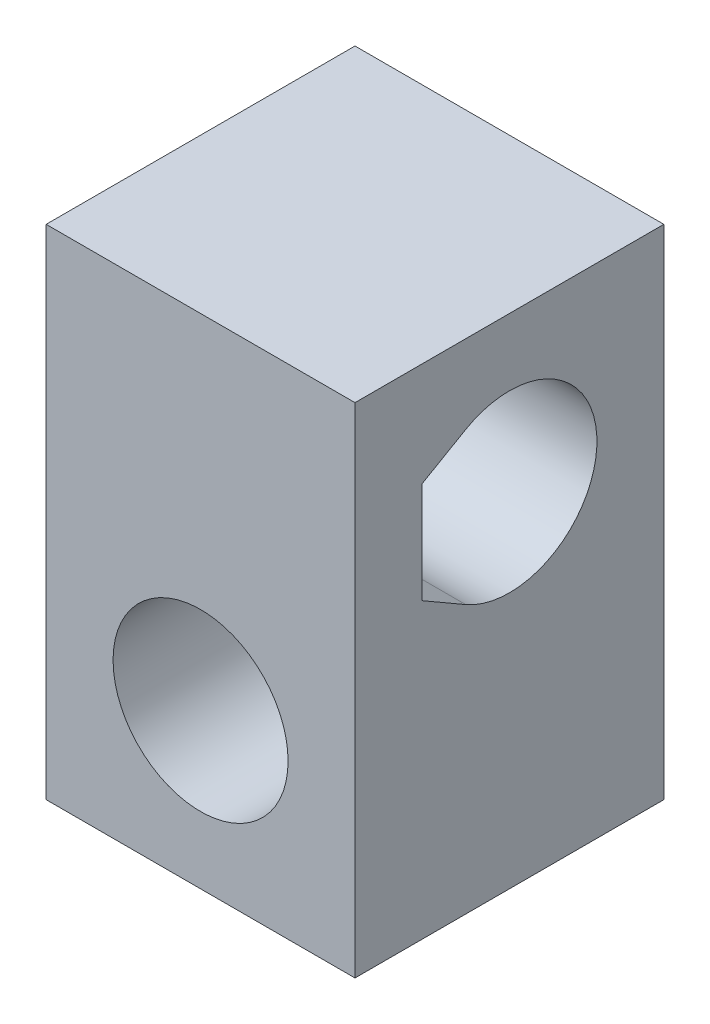
ISO-10303-21;
HEADER;
FILE_DESCRIPTION(('STEP AP214'),'2;1');
FILE_NAME('part.step','',(''),(''),'','','');
FILE_SCHEMA(('AUTOMOTIVE_DESIGN { 1 0 10303 214 1 1 1 1 }'));
ENDSEC;
DATA;
#1=APPLICATION_CONTEXT('core data for automotive mechanical design processes');
#2=APPLICATION_PROTOCOL_DEFINITION('international standard','automotive_design',2000,#1);
#3=PRODUCT_CONTEXT('',#1,'mechanical');
#4=PRODUCT('Part','Part','',(#3));
#5=PRODUCT_RELATED_PRODUCT_CATEGORY('part','',(#4));
#6=PRODUCT_DEFINITION_FORMATION('','',#4);
#7=PRODUCT_DEFINITION_CONTEXT('part definition',#1,'design');
#8=PRODUCT_DEFINITION('design','',#6,#7);
#9=PRODUCT_DEFINITION_SHAPE('','',#8);
#10=(LENGTH_UNIT() NAMED_UNIT(*) SI_UNIT(.MILLI.,.METRE.));
#11=(NAMED_UNIT(*) PLANE_ANGLE_UNIT() SI_UNIT($,.RADIAN.));
#12=(NAMED_UNIT(*) SI_UNIT($,.STERADIAN.) SOLID_ANGLE_UNIT());
#13=UNCERTAINTY_MEASURE_WITH_UNIT(LENGTH_MEASURE(1.E-05),#10,'distance_accuracy_value','');
#14=(GEOMETRIC_REPRESENTATION_CONTEXT(3) GLOBAL_UNCERTAINTY_ASSIGNED_CONTEXT((#13)) GLOBAL_UNIT_ASSIGNED_CONTEXT((#10,
#11,#12)) REPRESENTATION_CONTEXT('',''));
#15=CARTESIAN_POINT('',(0.,0.,0.));
#16=DIRECTION('',(0.,0.,1.));
#17=DIRECTION('',(1.,0.,0.));
#18=AXIS2_PLACEMENT_3D('',#15,#16,#17);
#19=CARTESIAN_POINT('',(0.,0.,7.5));
#20=DIRECTION('',(0.,0.,-1.));
#21=DIRECTION('',(-1.,0.,0.));
#22=AXIS2_PLACEMENT_3D('',#19,#20,#21);
#23=PLANE('',#22);
#24=DIRECTION('',(0.,1.,0.));
#25=VECTOR('',#24,1.);
#26=CARTESIAN_POINT('',(7.5,-12.1,7.5));
#27=LINE('',#26,#25);
#28=CARTESIAN_POINT('',(7.5,-12.1,7.5));
#29=VERTEX_POINT('',#28);
#30=CARTESIAN_POINT('',(7.5,12.1,7.5));
#31=VERTEX_POINT('',#30);
#32=EDGE_CURVE('E140',#29,#31,#27,.T.);
#33=ORIENTED_EDGE('',*,*,#32,.T.);
#34=DIRECTION('',(-1.,0.,0.));
#35=VECTOR('',#34,1.);
#36=CARTESIAN_POINT('',(-7.5,12.1,7.5));
#37=LINE('',#36,#35);
#38=CARTESIAN_POINT('',(-7.5,12.1,7.5));
#39=VERTEX_POINT('',#38);
#40=EDGE_CURVE('E143',#31,#39,#37,.T.);
#41=ORIENTED_EDGE('',*,*,#40,.T.);
#42=DIRECTION('',(0.,-1.,0.));
#43=VECTOR('',#42,1.);
#44=CARTESIAN_POINT('',(-7.5,-12.1,7.5));
#45=LINE('',#44,#43);
#46=CARTESIAN_POINT('',(-7.5,-12.1,7.5));
#47=VERTEX_POINT('',#46);
#48=EDGE_CURVE('E146',#39,#47,#45,.T.);
#49=ORIENTED_EDGE('',*,*,#48,.T.);
#50=DIRECTION('',(1.,0.,0.));
#51=VECTOR('',#50,1.);
#52=CARTESIAN_POINT('',(-7.5,-12.1,7.5));
#53=LINE('',#52,#51);
#54=EDGE_CURVE('E148',#47,#29,#53,.T.);
#55=ORIENTED_EDGE('',*,*,#54,.T.);
#56=EDGE_LOOP('',(#33,#41,#49,#55));
#57=FACE_BOUND('',#56,.T.);
#58=CARTESIAN_POINT('',(0.,-4.59999999999999,7.5));
#59=DIRECTION('',(0.,0.,1.));
#60=DIRECTION('',(1.,0.,0.));
#61=AXIS2_PLACEMENT_3D('',#58,#59,#60);
#62=CIRCLE('',#61,4.25);
#63=CARTESIAN_POINT('',(4.24999999999998,-4.59999999999999,7.5));
#64=VERTEX_POINT('',#63);
#65=EDGE_CURVE('E134',#64,#64,#62,.T.);
#66=ORIENTED_EDGE('',*,*,#65,.F.);
#67=EDGE_LOOP('',(#66));
#68=FACE_BOUND('',#67,.T.);
#69=ADVANCED_FACE('F33',(#57,#68),#23,.F.);
#70=CARTESIAN_POINT('',(0.,0.,-7.5));
#71=DIRECTION('',(0.,0.,-1.));
#72=DIRECTION('',(-1.,0.,0.));
#73=AXIS2_PLACEMENT_3D('',#70,#71,#72);
#74=PLANE('',#73);
#75=DIRECTION('',(0.,1.,0.));
#76=VECTOR('',#75,1.);
#77=CARTESIAN_POINT('',(7.5,-12.1,-7.5));
#78=LINE('',#77,#76);
#79=CARTESIAN_POINT('',(7.5,-12.1,-7.5));
#80=VERTEX_POINT('',#79);
#81=CARTESIAN_POINT('',(7.5,12.1,-7.5));
#82=VERTEX_POINT('',#81);
#83=EDGE_CURVE('E137',#80,#82,#78,.T.);
#84=ORIENTED_EDGE('',*,*,#83,.F.);
#85=DIRECTION('',(1.,0.,0.));
#86=VECTOR('',#85,1.);
#87=CARTESIAN_POINT('',(-7.5,-12.1,-7.5));
#88=LINE('',#87,#86);
#89=CARTESIAN_POINT('',(-7.5,-12.1,-7.5));
#90=VERTEX_POINT('',#89);
#91=EDGE_CURVE('E144',#90,#80,#88,.T.);
#92=ORIENTED_EDGE('',*,*,#91,.F.);
#93=DIRECTION('',(0.,-1.,0.));
#94=VECTOR('',#93,1.);
#95=CARTESIAN_POINT('',(-7.5,-12.1,-7.5));
#96=LINE('',#95,#94);
#97=CARTESIAN_POINT('',(-7.5,12.1,-7.5));
#98=VERTEX_POINT('',#97);
#99=EDGE_CURVE('E155',#98,#90,#96,.T.);
#100=ORIENTED_EDGE('',*,*,#99,.F.);
#101=DIRECTION('',(-1.,0.,0.));
#102=VECTOR('',#101,1.);
#103=CARTESIAN_POINT('',(-7.5,12.1,-7.5));
#104=LINE('',#103,#102);
#105=EDGE_CURVE('E153',#82,#98,#104,.T.);
#106=ORIENTED_EDGE('',*,*,#105,.F.);
#107=EDGE_LOOP('',(#84,#92,#100,#106));
#108=FACE_BOUND('',#107,.T.);
#109=CARTESIAN_POINT('',(0.,-4.59999999999999,-7.5));
#110=DIRECTION('',(0.,0.,1.));
#111=DIRECTION('',(1.,0.,0.));
#112=AXIS2_PLACEMENT_3D('',#109,#110,#111);
#113=CIRCLE('',#112,4.25);
#114=CARTESIAN_POINT('',(4.24999999999998,-4.59999999999999,-7.5));
#115=VERTEX_POINT('',#114);
#116=EDGE_CURVE('E112',#115,#115,#113,.T.);
#117=ORIENTED_EDGE('',*,*,#116,.T.);
#118=EDGE_LOOP('',(#117));
#119=FACE_BOUND('',#118,.T.);
#120=ADVANCED_FACE('F173',(#108,#119),#74,.T.);
#121=CARTESIAN_POINT('',(7.5,-12.1,7.5));
#122=DIRECTION('',(-1.,0.,0.));
#123=DIRECTION('',(0.,-1.,0.));
#124=AXIS2_PLACEMENT_3D('',#121,#122,#123);
#125=PLANE('',#124);
#126=DIRECTION('',(0.,-1.,0.));
#127=VECTOR('',#126,1.);
#128=CARTESIAN_POINT('',(7.5,2.14626135594408,4.25));
#129=LINE('',#128,#127);
#130=CARTESIAN_POINT('',(7.5,7.05373864405591,4.25));
#131=VERTEX_POINT('',#130);
#132=CARTESIAN_POINT('',(7.5,2.14626135594408,4.25));
#133=VERTEX_POINT('',#132);
#134=EDGE_CURVE('E117',#131,#133,#129,.T.);
#135=ORIENTED_EDGE('',*,*,#134,.F.);
#136=DIRECTION('',(0.,-0.499999999999998,0.86602540378444));
#137=VECTOR('',#136,1.);
#138=CARTESIAN_POINT('',(7.5,7.05373864405591,4.25));
#139=LINE('',#138,#137);
#140=CARTESIAN_POINT('',(7.5,8.28060796608387,2.12499999999999));
#141=VERTEX_POINT('',#140);
#142=EDGE_CURVE('E100',#141,#131,#139,.T.);
#143=ORIENTED_EDGE('',*,*,#142,.F.);
#144=CARTESIAN_POINT('',(7.5,4.6,0.));
#145=DIRECTION('',(-1.,0.,0.));
#146=DIRECTION('',(0.,-1.,0.));
#147=AXIS2_PLACEMENT_3D('',#144,#145,#146);
#148=CIRCLE('',#147,4.25);
#149=CARTESIAN_POINT('',(7.5,0.919392033916129,2.12499999999999));
#150=VERTEX_POINT('',#149);
#151=EDGE_CURVE('E109',#150,#141,#148,.F.);
#152=ORIENTED_EDGE('',*,*,#151,.F.);
#153=DIRECTION('',(0.,-0.499999999999999,-0.866025403784439));
#154=VECTOR('',#153,1.);
#155=CARTESIAN_POINT('',(7.5,2.14626135594408,4.25));
#156=LINE('',#155,#154);
#157=EDGE_CURVE('E48',#133,#150,#156,.T.);
#158=ORIENTED_EDGE('',*,*,#157,.F.);
#159=EDGE_LOOP('',(#135,#143,#152,#158));
#160=FACE_BOUND('',#159,.T.);
#161=ORIENTED_EDGE('',*,*,#83,.T.);
#162=DIRECTION('',(0.,0.,-1.));
#163=VECTOR('',#162,1.);
#164=CARTESIAN_POINT('',(7.5,12.1,7.5));
#165=LINE('',#164,#163);
#166=EDGE_CURVE('E11',#31,#82,#165,.T.);
#167=ORIENTED_EDGE('',*,*,#166,.F.);
#168=ORIENTED_EDGE('',*,*,#32,.F.);
#169=DIRECTION('',(0.,0.,-1.));
#170=VECTOR('',#169,1.);
#171=CARTESIAN_POINT('',(7.5,-12.1,7.5));
#172=LINE('',#171,#170);
#173=EDGE_CURVE('E150',#29,#80,#172,.T.);
#174=ORIENTED_EDGE('',*,*,#173,.T.);
#175=EDGE_LOOP('',(#161,#167,#168,#174));
#176=FACE_BOUND('',#175,.T.);
#177=ADVANCED_FACE('F35',(#160,#176),#125,.F.);
#178=CARTESIAN_POINT('',(-7.5,12.1,7.5));
#179=DIRECTION('',(0.,-1.,0.));
#180=DIRECTION('',(1.,0.,0.));
#181=AXIS2_PLACEMENT_3D('',#178,#179,#180);
#182=PLANE('',#181);
#183=ORIENTED_EDGE('',*,*,#105,.T.);
#184=DIRECTION('',(0.,0.,-1.));
#185=VECTOR('',#184,1.);
#186=CARTESIAN_POINT('',(-7.5,12.1,7.5));
#187=LINE('',#186,#185);
#188=EDGE_CURVE('E41',#39,#98,#187,.T.);
#189=ORIENTED_EDGE('',*,*,#188,.F.);
#190=ORIENTED_EDGE('',*,*,#40,.F.);
#191=ORIENTED_EDGE('',*,*,#166,.T.);
#192=EDGE_LOOP('',(#183,#189,#190,#191));
#193=FACE_BOUND('',#192,.T.);
#194=ADVANCED_FACE('F183',(#193),#182,.F.);
#195=CARTESIAN_POINT('',(-7.5,-12.1,7.5));
#196=DIRECTION('',(1.,0.,0.));
#197=DIRECTION('',(0.,0.,-1.));
#198=AXIS2_PLACEMENT_3D('',#195,#196,#197);
#199=PLANE('',#198);
#200=CARTESIAN_POINT('',(-7.5,4.6,0.));
#201=DIRECTION('',(-1.,0.,0.));
#202=DIRECTION('',(0.,0.,1.));
#203=AXIS2_PLACEMENT_3D('',#200,#201,#202);
#204=CIRCLE('',#203,4.25);
#205=CARTESIAN_POINT('',(-7.5,8.28060796608387,2.12499999999999));
#206=VERTEX_POINT('',#205);
#207=CARTESIAN_POINT('',(-7.5,0.919392033916129,2.12499999999999));
#208=VERTEX_POINT('',#207);
#209=EDGE_CURVE('E119',#206,#208,#204,.T.);
#210=ORIENTED_EDGE('',*,*,#209,.F.);
#211=DIRECTION('',(0.,0.499999999999998,-0.86602540378444));
#212=VECTOR('',#211,1.);
#213=CARTESIAN_POINT('',(-7.5,7.05373864405591,4.25));
#214=LINE('',#213,#212);
#215=CARTESIAN_POINT('',(-7.5,7.05373864405591,4.25));
#216=VERTEX_POINT('',#215);
#217=EDGE_CURVE('E56',#216,#206,#214,.T.);
#218=ORIENTED_EDGE('',*,*,#217,.F.);
#219=DIRECTION('',(0.,1.,0.));
#220=VECTOR('',#219,1.);
#221=CARTESIAN_POINT('',(-7.5,2.14626135594408,4.25));
#222=LINE('',#221,#220);
#223=CARTESIAN_POINT('',(-7.5,2.14626135594408,4.25));
#224=VERTEX_POINT('',#223);
#225=EDGE_CURVE('E106',#224,#216,#222,.T.);
#226=ORIENTED_EDGE('',*,*,#225,.F.);
#227=DIRECTION('',(0.,0.499999999999999,0.866025403784439));
#228=VECTOR('',#227,1.);
#229=CARTESIAN_POINT('',(-7.5,2.14626135594408,4.25));
#230=LINE('',#229,#228);
#231=EDGE_CURVE('E125',#208,#224,#230,.T.);
#232=ORIENTED_EDGE('',*,*,#231,.F.);
#233=EDGE_LOOP('',(#210,#218,#226,#232));
#234=FACE_BOUND('',#233,.T.);
#235=ORIENTED_EDGE('',*,*,#99,.T.);
#236=DIRECTION('',(0.,0.,-1.));
#237=VECTOR('',#236,1.);
#238=CARTESIAN_POINT('',(-7.5,-12.1,7.5));
#239=LINE('',#238,#237);
#240=EDGE_CURVE('E160',#47,#90,#239,.T.);
#241=ORIENTED_EDGE('',*,*,#240,.F.);
#242=ORIENTED_EDGE('',*,*,#48,.F.);
#243=ORIENTED_EDGE('',*,*,#188,.T.);
#244=EDGE_LOOP('',(#235,#241,#242,#243));
#245=FACE_BOUND('',#244,.T.);
#246=ADVANCED_FACE('F167',(#234,#245),#199,.F.);
#247=CARTESIAN_POINT('',(-7.5,-12.1,7.5));
#248=DIRECTION('',(0.,1.,0.));
#249=DIRECTION('',(-1.,0.,0.));
#250=AXIS2_PLACEMENT_3D('',#247,#248,#249);
#251=PLANE('',#250);
#252=ORIENTED_EDGE('',*,*,#91,.T.);
#253=ORIENTED_EDGE('',*,*,#173,.F.);
#254=ORIENTED_EDGE('',*,*,#54,.F.);
#255=ORIENTED_EDGE('',*,*,#240,.T.);
#256=EDGE_LOOP('',(#252,#253,#254,#255));
#257=FACE_BOUND('',#256,.T.);
#258=ADVANCED_FACE('F177',(#257),#251,.F.);
#259=CARTESIAN_POINT('',(0.,-4.59999999999999,7.5));
#260=DIRECTION('',(0.,0.,-1.));
#261=DIRECTION('',(-1.,0.,0.));
#262=AXIS2_PLACEMENT_3D('',#259,#260,#261);
#263=CYLINDRICAL_SURFACE('',#262,4.25);
#264=ORIENTED_EDGE('',*,*,#65,.T.);
#265=EDGE_LOOP('',(#264));
#266=FACE_BOUND('',#265,.T.);
#267=ORIENTED_EDGE('',*,*,#116,.F.);
#268=EDGE_LOOP('',(#267));
#269=FACE_BOUND('',#268,.T.);
#270=ADVANCED_FACE('F198',(#266,#269),#263,.F.);
#271=CARTESIAN_POINT('',(7.501,7.05373864405591,4.25));
#272=DIRECTION('',(0.,0.86602540378444,0.499999999999998));
#273=DIRECTION('',(0.,-0.499999999999998,0.86602540378444));
#274=AXIS2_PLACEMENT_3D('',#271,#272,#273);
#275=PLANE('',#274);
#276=ORIENTED_EDGE('',*,*,#142,.T.);
#277=DIRECTION('',(-1.,0.,0.));
#278=VECTOR('',#277,1.);
#279=CARTESIAN_POINT('',(7.501,7.05373864405591,4.25));
#280=LINE('',#279,#278);
#281=EDGE_CURVE('E113',#131,#216,#280,.T.);
#282=ORIENTED_EDGE('',*,*,#281,.T.);
#283=ORIENTED_EDGE('',*,*,#217,.T.);
#284=DIRECTION('',(-1.,0.,0.));
#285=VECTOR('',#284,1.);
#286=CARTESIAN_POINT('',(7.501,8.28060796608387,2.12499999999999));
#287=LINE('',#286,#285);
#288=EDGE_CURVE('E96',#141,#206,#287,.T.);
#289=ORIENTED_EDGE('',*,*,#288,.F.);
#290=EDGE_LOOP('',(#276,#282,#283,#289));
#291=FACE_BOUND('',#290,.T.);
#292=ADVANCED_FACE('F98',(#291),#275,.F.);
#293=CARTESIAN_POINT('',(7.501,2.14626135594408,4.25));
#294=DIRECTION('',(0.,0.,1.));
#295=DIRECTION('',(0.,-1.,0.));
#296=AXIS2_PLACEMENT_3D('',#293,#294,#295);
#297=PLANE('',#296);
#298=ORIENTED_EDGE('',*,*,#134,.T.);
#299=DIRECTION('',(-1.,0.,0.));
#300=VECTOR('',#299,1.);
#301=CARTESIAN_POINT('',(7.501,2.14626135594408,4.25));
#302=LINE('',#301,#300);
#303=EDGE_CURVE('E131',#133,#224,#302,.T.);
#304=ORIENTED_EDGE('',*,*,#303,.T.);
#305=ORIENTED_EDGE('',*,*,#225,.T.);
#306=ORIENTED_EDGE('',*,*,#281,.F.);
#307=EDGE_LOOP('',(#298,#304,#305,#306));
#308=FACE_BOUND('',#307,.T.);
#309=ADVANCED_FACE('F209',(#308),#297,.F.);
#310=CARTESIAN_POINT('',(7.501,2.14626135594408,4.25));
#311=DIRECTION('',(0.,-0.866025403784439,0.499999999999999));
#312=DIRECTION('',(0.,-0.499999999999999,-0.866025403784439));
#313=AXIS2_PLACEMENT_3D('',#310,#311,#312);
#314=PLANE('',#313);
#315=ORIENTED_EDGE('',*,*,#157,.T.);
#316=DIRECTION('',(-1.,0.,0.));
#317=VECTOR('',#316,1.);
#318=CARTESIAN_POINT('',(7.501,0.919392033916129,2.12499999999999));
#319=LINE('',#318,#317);
#320=EDGE_CURVE('E105',#150,#208,#319,.T.);
#321=ORIENTED_EDGE('',*,*,#320,.T.);
#322=ORIENTED_EDGE('',*,*,#231,.T.);
#323=ORIENTED_EDGE('',*,*,#303,.F.);
#324=EDGE_LOOP('',(#315,#321,#322,#323));
#325=FACE_BOUND('',#324,.T.);
#326=ADVANCED_FACE('F216',(#325),#314,.F.);
#327=CARTESIAN_POINT('',(7.501,4.6,0.));
#328=DIRECTION('',(-1.,0.,0.));
#329=DIRECTION('',(0.,0.,1.));
#330=AXIS2_PLACEMENT_3D('',#327,#328,#329);
#331=CYLINDRICAL_SURFACE('',#330,4.25);
#332=ORIENTED_EDGE('',*,*,#151,.T.);
#333=ORIENTED_EDGE('',*,*,#288,.T.);
#334=ORIENTED_EDGE('',*,*,#209,.T.);
#335=ORIENTED_EDGE('',*,*,#320,.F.);
#336=EDGE_LOOP('',(#332,#333,#334,#335));
#337=FACE_BOUND('',#336,.T.);
#338=ADVANCED_FACE('F110',(#337),#331,.F.);
#339=CLOSED_SHELL('',(#69,#120,#177,#194,#246,#258,#270,#292,#309,#326,#338));
#340=MANIFOLD_SOLID_BREP('B2',#339);
#341=ADVANCED_BREP_SHAPE_REPRESENTATION('',(#18,#340),#14);
#342=SHAPE_DEFINITION_REPRESENTATION(#9,#341);
ENDSEC;
END-ISO-10303-21;
